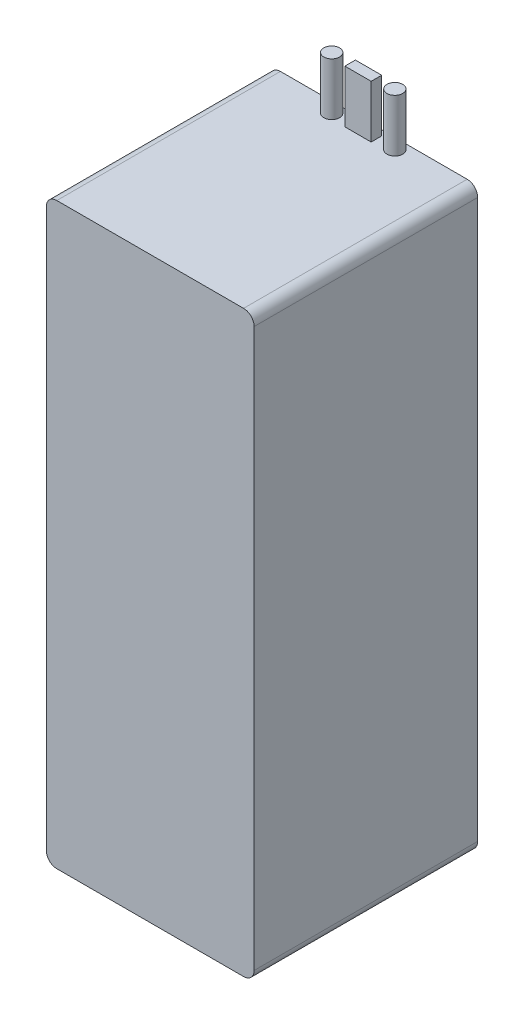
ISO-10303-21;
HEADER;
FILE_DESCRIPTION(('STEP AP214'),'2;1');
FILE_NAME('part.step','',(''),(''),'','','');
FILE_SCHEMA(('AUTOMOTIVE_DESIGN { 1 0 10303 214 1 1 1 1 }'));
ENDSEC;
DATA;
#1=APPLICATION_CONTEXT('core data for automotive mechanical design processes');
#2=APPLICATION_PROTOCOL_DEFINITION('international standard','automotive_design',2000,#1);
#3=PRODUCT_CONTEXT('',#1,'mechanical');
#4=PRODUCT('Part','Part','',(#3));
#5=PRODUCT_RELATED_PRODUCT_CATEGORY('part','',(#4));
#6=PRODUCT_DEFINITION_FORMATION('','',#4);
#7=PRODUCT_DEFINITION_CONTEXT('part definition',#1,'design');
#8=PRODUCT_DEFINITION('design','',#6,#7);
#9=PRODUCT_DEFINITION_SHAPE('','',#8);
#10=(LENGTH_UNIT() NAMED_UNIT(*) SI_UNIT(.MILLI.,.METRE.));
#11=(NAMED_UNIT(*) PLANE_ANGLE_UNIT() SI_UNIT($,.RADIAN.));
#12=(NAMED_UNIT(*) SI_UNIT($,.STERADIAN.) SOLID_ANGLE_UNIT());
#13=UNCERTAINTY_MEASURE_WITH_UNIT(LENGTH_MEASURE(1.E-05),#10,'distance_accuracy_value','');
#14=(GEOMETRIC_REPRESENTATION_CONTEXT(3) GLOBAL_UNCERTAINTY_ASSIGNED_CONTEXT((#13)) GLOBAL_UNIT_ASSIGNED_CONTEXT((#10,
#11,#12)) REPRESENTATION_CONTEXT('',''));
#15=CARTESIAN_POINT('',(0.,0.,0.));
#16=DIRECTION('',(0.,0.,1.));
#17=DIRECTION('',(1.,0.,0.));
#18=AXIS2_PLACEMENT_3D('',#15,#16,#17);
#19=CARTESIAN_POINT('',(0.,110.,0.));
#20=DIRECTION('',(0.,-1.,0.));
#21=DIRECTION('',(0.,0.,-1.));
#22=AXIS2_PLACEMENT_3D('',#19,#20,#21);
#23=PLANE('',#22);
#24=DIRECTION('',(1.,0.,0.));
#25=VECTOR('',#24,1.);
#26=CARTESIAN_POINT('',(-19.75,110.,21.25));
#27=LINE('',#26,#25);
#28=CARTESIAN_POINT('',(-17.75,110.,21.25));
#29=VERTEX_POINT('',#28);
#30=CARTESIAN_POINT('',(17.75,110.,21.25));
#31=VERTEX_POINT('',#30);
#32=EDGE_CURVE('E165',#29,#31,#27,.T.);
#33=ORIENTED_EDGE('',*,*,#32,.T.);
#34=DIRECTION('',(0.,0.,-1.));
#35=VECTOR('',#34,1.);
#36=CARTESIAN_POINT('',(17.75,110.,0.));
#37=LINE('',#36,#35);
#38=CARTESIAN_POINT('',(17.75,110.,-21.25));
#39=VERTEX_POINT('',#38);
#40=EDGE_CURVE('E193',#31,#39,#37,.T.);
#41=ORIENTED_EDGE('',*,*,#40,.T.);
#42=DIRECTION('',(-1.,0.,0.));
#43=VECTOR('',#42,1.);
#44=CARTESIAN_POINT('',(-19.75,110.,-21.25));
#45=LINE('',#44,#43);
#46=CARTESIAN_POINT('',(-17.75,110.,-21.25));
#47=VERTEX_POINT('',#46);
#48=EDGE_CURVE('E162',#39,#47,#45,.T.);
#49=ORIENTED_EDGE('',*,*,#48,.T.);
#50=DIRECTION('',(0.,0.,1.));
#51=VECTOR('',#50,1.);
#52=CARTESIAN_POINT('',(-17.75,110.,0.));
#53=LINE('',#52,#51);
#54=EDGE_CURVE('E190',#47,#29,#53,.T.);
#55=ORIENTED_EDGE('',*,*,#54,.T.);
#56=EDGE_LOOP('',(#33,#41,#49,#55));
#57=FACE_BOUND('',#56,.T.);
#58=CARTESIAN_POINT('',(-6.00000000000001,110.,-19.25));
#59=DIRECTION('',(0.,-1.,0.));
#60=DIRECTION('',(0.,0.,-1.));
#61=AXIS2_PLACEMENT_3D('',#58,#59,#60);
#62=CIRCLE('',#61,1.5);
#63=CARTESIAN_POINT('',(-6.00000000000001,110.,-20.75));
#64=VERTEX_POINT('',#63);
#65=EDGE_CURVE('E184',#64,#64,#62,.F.);
#66=ORIENTED_EDGE('',*,*,#65,.F.);
#67=EDGE_LOOP('',(#66));
#68=FACE_BOUND('',#67,.T.);
#69=CARTESIAN_POINT('',(6.,110.,-19.25));
#70=DIRECTION('',(0.,-1.,0.));
#71=DIRECTION('',(0.,0.,-1.));
#72=AXIS2_PLACEMENT_3D('',#69,#70,#71);
#73=CIRCLE('',#72,1.5);
#74=CARTESIAN_POINT('',(6.,110.,-20.75));
#75=VERTEX_POINT('',#74);
#76=EDGE_CURVE('E187',#75,#75,#73,.F.);
#77=ORIENTED_EDGE('',*,*,#76,.F.);
#78=EDGE_LOOP('',(#77));
#79=FACE_BOUND('',#78,.T.);
#80=DIRECTION('',(0.,0.,-1.));
#81=VECTOR('',#80,1.);
#82=CARTESIAN_POINT('',(2.49999999999999,110.,-20.25));
#83=LINE('',#82,#81);
#84=CARTESIAN_POINT('',(2.49999999999999,110.,-18.25));
#85=VERTEX_POINT('',#84);
#86=CARTESIAN_POINT('',(2.49999999999999,110.,-20.25));
#87=VERTEX_POINT('',#86);
#88=EDGE_CURVE('E149',#85,#87,#83,.T.);
#89=ORIENTED_EDGE('',*,*,#88,.F.);
#90=DIRECTION('',(1.,0.,0.));
#91=VECTOR('',#90,1.);
#92=CARTESIAN_POINT('',(-2.50000000000001,110.,-18.25));
#93=LINE('',#92,#91);
#94=CARTESIAN_POINT('',(-2.50000000000001,110.,-18.25));
#95=VERTEX_POINT('',#94);
#96=EDGE_CURVE('E146',#95,#85,#93,.T.);
#97=ORIENTED_EDGE('',*,*,#96,.F.);
#98=DIRECTION('',(0.,0.,1.));
#99=VECTOR('',#98,1.);
#100=CARTESIAN_POINT('',(-2.50000000000001,110.,-20.25));
#101=LINE('',#100,#99);
#102=CARTESIAN_POINT('',(-2.50000000000001,110.,-20.25));
#103=VERTEX_POINT('',#102);
#104=EDGE_CURVE('E427',#103,#95,#101,.T.);
#105=ORIENTED_EDGE('',*,*,#104,.F.);
#106=DIRECTION('',(-1.,0.,0.));
#107=VECTOR('',#106,1.);
#108=CARTESIAN_POINT('',(-2.50000000000001,110.,-20.25));
#109=LINE('',#108,#107);
#110=EDGE_CURVE('E433',#87,#103,#109,.T.);
#111=ORIENTED_EDGE('',*,*,#110,.F.);
#112=EDGE_LOOP('',(#89,#97,#105,#111));
#113=FACE_BOUND('',#112,.T.);
#114=ADVANCED_FACE('F35',(#57,#68,#79,#113),#23,.F.);
#115=CARTESIAN_POINT('',(19.75,110.,21.25));
#116=DIRECTION('',(-1.,0.,0.));
#117=DIRECTION('',(0.,0.,1.));
#118=AXIS2_PLACEMENT_3D('',#115,#116,#117);
#119=PLANE('',#118);
#120=DIRECTION('',(0.,-1.,0.));
#121=VECTOR('',#120,1.);
#122=CARTESIAN_POINT('',(19.75,110.,-21.25));
#123=LINE('',#122,#121);
#124=CARTESIAN_POINT('',(19.75,108.,-21.25));
#125=VERTEX_POINT('',#124);
#126=CARTESIAN_POINT('',(19.75,2.,-21.25));
#127=VERTEX_POINT('',#126);
#128=EDGE_CURVE('E181',#125,#127,#123,.T.);
#129=ORIENTED_EDGE('',*,*,#128,.F.);
#130=DIRECTION('',(0.,0.,-1.));
#131=VECTOR('',#130,1.);
#132=CARTESIAN_POINT('',(19.75,108.,21.25));
#133=LINE('',#132,#131);
#134=CARTESIAN_POINT('',(19.75,108.,21.25));
#135=VERTEX_POINT('',#134);
#136=EDGE_CURVE('E207',#125,#135,#133,.F.);
#137=ORIENTED_EDGE('',*,*,#136,.T.);
#138=DIRECTION('',(0.,-1.,0.));
#139=VECTOR('',#138,1.);
#140=CARTESIAN_POINT('',(19.75,110.,21.25));
#141=LINE('',#140,#139);
#142=CARTESIAN_POINT('',(19.75,2.,21.25));
#143=VERTEX_POINT('',#142);
#144=EDGE_CURVE('E169',#135,#143,#141,.T.);
#145=ORIENTED_EDGE('',*,*,#144,.T.);
#146=DIRECTION('',(0.,0.,-1.));
#147=VECTOR('',#146,1.);
#148=CARTESIAN_POINT('',(19.75,2.,-21.25));
#149=LINE('',#148,#147);
#150=EDGE_CURVE('E204',#143,#127,#149,.T.);
#151=ORIENTED_EDGE('',*,*,#150,.T.);
#152=EDGE_LOOP('',(#129,#137,#145,#151));
#153=FACE_BOUND('',#152,.T.);
#154=ADVANCED_FACE('F239',(#153),#119,.F.);
#155=CARTESIAN_POINT('',(-19.75,110.,-21.25));
#156=DIRECTION('',(0.,0.,1.));
#157=DIRECTION('',(1.,0.,0.));
#158=AXIS2_PLACEMENT_3D('',#155,#156,#157);
#159=PLANE('',#158);
#160=ORIENTED_EDGE('',*,*,#48,.F.);
#161=CARTESIAN_POINT('',(17.75,108.,-21.25));
#162=DIRECTION('',(0.,0.,1.));
#163=DIRECTION('',(1.,0.,0.));
#164=AXIS2_PLACEMENT_3D('',#161,#162,#163);
#165=CIRCLE('',#164,2.);
#166=EDGE_CURVE('E202',#39,#125,#165,.F.);
#167=ORIENTED_EDGE('',*,*,#166,.T.);
#168=ORIENTED_EDGE('',*,*,#128,.T.);
#169=CARTESIAN_POINT('',(17.75,2.,-21.25));
#170=DIRECTION('',(0.,0.,1.));
#171=DIRECTION('',(1.,0.,0.));
#172=AXIS2_PLACEMENT_3D('',#169,#170,#171);
#173=CIRCLE('',#172,2.);
#174=CARTESIAN_POINT('',(17.75,0.,-21.25));
#175=VERTEX_POINT('',#174);
#176=EDGE_CURVE('E198',#127,#175,#173,.F.);
#177=ORIENTED_EDGE('',*,*,#176,.T.);
#178=DIRECTION('',(-1.,0.,0.));
#179=VECTOR('',#178,1.);
#180=CARTESIAN_POINT('',(-19.75,0.,-21.25));
#181=LINE('',#180,#179);
#182=CARTESIAN_POINT('',(-17.75,0.,-21.25));
#183=VERTEX_POINT('',#182);
#184=EDGE_CURVE('E161',#175,#183,#181,.T.);
#185=ORIENTED_EDGE('',*,*,#184,.T.);
#186=CARTESIAN_POINT('',(-17.75,2.,-21.25));
#187=DIRECTION('',(0.,0.,1.));
#188=DIRECTION('',(1.,0.,0.));
#189=AXIS2_PLACEMENT_3D('',#186,#187,#188);
#190=CIRCLE('',#189,2.);
#191=CARTESIAN_POINT('',(-19.75,2.,-21.25));
#192=VERTEX_POINT('',#191);
#193=EDGE_CURVE('E196',#183,#192,#190,.F.);
#194=ORIENTED_EDGE('',*,*,#193,.T.);
#195=DIRECTION('',(0.,-1.,0.));
#196=VECTOR('',#195,1.);
#197=CARTESIAN_POINT('',(-19.75,110.,-21.25));
#198=LINE('',#197,#196);
#199=CARTESIAN_POINT('',(-19.75,108.,-21.25));
#200=VERTEX_POINT('',#199);
#201=EDGE_CURVE('E178',#200,#192,#198,.T.);
#202=ORIENTED_EDGE('',*,*,#201,.F.);
#203=CARTESIAN_POINT('',(-17.75,108.,-21.25));
#204=DIRECTION('',(0.,0.,1.));
#205=DIRECTION('',(1.,0.,0.));
#206=AXIS2_PLACEMENT_3D('',#203,#204,#205);
#207=CIRCLE('',#206,2.);
#208=EDGE_CURVE('E200',#200,#47,#207,.F.);
#209=ORIENTED_EDGE('',*,*,#208,.T.);
#210=EDGE_LOOP('',(#160,#167,#168,#177,#185,#194,#202,#209));
#211=FACE_BOUND('',#210,.T.);
#212=ADVANCED_FACE('F226',(#211),#159,.F.);
#213=CARTESIAN_POINT('',(-19.75,110.,21.25));
#214=DIRECTION('',(1.,0.,0.));
#215=DIRECTION('',(0.,0.,-1.));
#216=AXIS2_PLACEMENT_3D('',#213,#214,#215);
#217=PLANE('',#216);
#218=DIRECTION('',(0.,-1.,0.));
#219=VECTOR('',#218,1.);
#220=CARTESIAN_POINT('',(-19.75,110.,21.25));
#221=LINE('',#220,#219);
#222=CARTESIAN_POINT('',(-19.75,108.,21.25));
#223=VERTEX_POINT('',#222);
#224=CARTESIAN_POINT('',(-19.75,2.,21.25));
#225=VERTEX_POINT('',#224);
#226=EDGE_CURVE('E176',#223,#225,#221,.T.);
#227=ORIENTED_EDGE('',*,*,#226,.F.);
#228=DIRECTION('',(0.,0.,1.));
#229=VECTOR('',#228,1.);
#230=CARTESIAN_POINT('',(-19.75,108.,21.25));
#231=LINE('',#230,#229);
#232=EDGE_CURVE('E217',#223,#200,#231,.F.);
#233=ORIENTED_EDGE('',*,*,#232,.T.);
#234=ORIENTED_EDGE('',*,*,#201,.T.);
#235=DIRECTION('',(0.,0.,1.));
#236=VECTOR('',#235,1.);
#237=CARTESIAN_POINT('',(-19.75,2.,21.25));
#238=LINE('',#237,#236);
#239=EDGE_CURVE('E215',#192,#225,#238,.T.);
#240=ORIENTED_EDGE('',*,*,#239,.T.);
#241=EDGE_LOOP('',(#227,#233,#234,#240));
#242=FACE_BOUND('',#241,.T.);
#243=ADVANCED_FACE('F229',(#242),#217,.F.);
#244=CARTESIAN_POINT('',(-19.75,110.,21.25));
#245=DIRECTION('',(0.,0.,-1.));
#246=DIRECTION('',(-1.,0.,0.));
#247=AXIS2_PLACEMENT_3D('',#244,#245,#246);
#248=PLANE('',#247);
#249=ORIENTED_EDGE('',*,*,#144,.F.);
#250=CARTESIAN_POINT('',(17.75,108.,21.25));
#251=DIRECTION('',(0.,0.,-1.));
#252=DIRECTION('',(-1.,0.,0.));
#253=AXIS2_PLACEMENT_3D('',#250,#251,#252);
#254=CIRCLE('',#253,2.);
#255=EDGE_CURVE('E213',#135,#31,#254,.F.);
#256=ORIENTED_EDGE('',*,*,#255,.T.);
#257=ORIENTED_EDGE('',*,*,#32,.F.);
#258=CARTESIAN_POINT('',(-17.75,108.,21.25));
#259=DIRECTION('',(0.,0.,-1.));
#260=DIRECTION('',(-1.,0.,0.));
#261=AXIS2_PLACEMENT_3D('',#258,#259,#260);
#262=CIRCLE('',#261,2.);
#263=EDGE_CURVE('E58',#29,#223,#262,.F.);
#264=ORIENTED_EDGE('',*,*,#263,.T.);
#265=ORIENTED_EDGE('',*,*,#226,.T.);
#266=CARTESIAN_POINT('',(-17.75,2.,21.25));
#267=DIRECTION('',(0.,0.,-1.));
#268=DIRECTION('',(-1.,0.,0.));
#269=AXIS2_PLACEMENT_3D('',#266,#267,#268);
#270=CIRCLE('',#269,2.);
#271=CARTESIAN_POINT('',(-17.75,0.,21.25));
#272=VERTEX_POINT('',#271);
#273=EDGE_CURVE('E50',#225,#272,#270,.F.);
#274=ORIENTED_EDGE('',*,*,#273,.T.);
#275=DIRECTION('',(1.,0.,0.));
#276=VECTOR('',#275,1.);
#277=CARTESIAN_POINT('',(-19.75,0.,21.25));
#278=LINE('',#277,#276);
#279=CARTESIAN_POINT('',(17.75,0.,21.25));
#280=VERTEX_POINT('',#279);
#281=EDGE_CURVE('E166',#272,#280,#278,.T.);
#282=ORIENTED_EDGE('',*,*,#281,.T.);
#283=CARTESIAN_POINT('',(17.75,2.,21.25));
#284=DIRECTION('',(0.,0.,-1.));
#285=DIRECTION('',(-1.,0.,0.));
#286=AXIS2_PLACEMENT_3D('',#283,#284,#285);
#287=CIRCLE('',#286,2.);
#288=EDGE_CURVE('E210',#280,#143,#287,.F.);
#289=ORIENTED_EDGE('',*,*,#288,.T.);
#290=EDGE_LOOP('',(#249,#256,#257,#264,#265,#274,#282,#289));
#291=FACE_BOUND('',#290,.T.);
#292=ADVANCED_FACE('F232',(#291),#248,.F.);
#293=CARTESIAN_POINT('',(0.,0.,0.));
#294=DIRECTION('',(0.,-1.,0.));
#295=DIRECTION('',(0.,0.,-1.));
#296=AXIS2_PLACEMENT_3D('',#293,#294,#295);
#297=PLANE('',#296);
#298=ORIENTED_EDGE('',*,*,#184,.F.);
#299=DIRECTION('',(0.,0.,-1.));
#300=VECTOR('',#299,1.);
#301=CARTESIAN_POINT('',(17.75,0.,21.25));
#302=LINE('',#301,#300);
#303=EDGE_CURVE('E11',#175,#280,#302,.F.);
#304=ORIENTED_EDGE('',*,*,#303,.T.);
#305=ORIENTED_EDGE('',*,*,#281,.F.);
#306=DIRECTION('',(0.,0.,1.));
#307=VECTOR('',#306,1.);
#308=CARTESIAN_POINT('',(-17.75,0.,-21.25));
#309=LINE('',#308,#307);
#310=EDGE_CURVE('E43',#272,#183,#309,.F.);
#311=ORIENTED_EDGE('',*,*,#310,.T.);
#312=EDGE_LOOP('',(#298,#304,#305,#311));
#313=FACE_BOUND('',#312,.T.);
#314=ADVANCED_FACE('F221',(#313),#297,.T.);
#315=CARTESIAN_POINT('',(-6.00000000000001,120.,-19.25));
#316=DIRECTION('',(0.,-1.,0.));
#317=DIRECTION('',(0.,0.,-1.));
#318=AXIS2_PLACEMENT_3D('',#315,#316,#317);
#319=CYLINDRICAL_SURFACE('',#318,1.5);
#320=CARTESIAN_POINT('',(-6.00000000000001,120.,-19.25));
#321=DIRECTION('',(0.,1.,0.));
#322=DIRECTION('',(0.,0.,1.));
#323=AXIS2_PLACEMENT_3D('',#320,#321,#322);
#324=CIRCLE('',#323,1.5);
#325=CARTESIAN_POINT('',(-6.00000000000001,120.,-17.75));
#326=VERTEX_POINT('',#325);
#327=EDGE_CURVE('E153',#326,#326,#324,.T.);
#328=ORIENTED_EDGE('',*,*,#327,.F.);
#329=EDGE_LOOP('',(#328));
#330=FACE_BOUND('',#329,.T.);
#331=ORIENTED_EDGE('',*,*,#65,.T.);
#332=EDGE_LOOP('',(#331));
#333=FACE_BOUND('',#332,.T.);
#334=ADVANCED_FACE('F266',(#330,#333),#319,.T.);
#335=CARTESIAN_POINT('',(-6.00000000000001,120.,-19.25));
#336=DIRECTION('',(0.,1.,0.));
#337=DIRECTION('',(0.,0.,1.));
#338=AXIS2_PLACEMENT_3D('',#335,#336,#337);
#339=PLANE('',#338);
#340=ORIENTED_EDGE('',*,*,#327,.T.);
#341=EDGE_LOOP('',(#340));
#342=FACE_BOUND('',#341,.T.);
#343=ADVANCED_FACE('F298',(#342),#339,.T.);
#344=CARTESIAN_POINT('',(6.,120.,-19.25));
#345=DIRECTION('',(0.,-1.,0.));
#346=DIRECTION('',(0.,0.,-1.));
#347=AXIS2_PLACEMENT_3D('',#344,#345,#346);
#348=CYLINDRICAL_SURFACE('',#347,1.5);
#349=CARTESIAN_POINT('',(6.,120.,-19.25));
#350=DIRECTION('',(0.,1.,0.));
#351=DIRECTION('',(0.,0.,1.));
#352=AXIS2_PLACEMENT_3D('',#349,#350,#351);
#353=CIRCLE('',#352,1.5);
#354=CARTESIAN_POINT('',(6.,120.,-17.75));
#355=VERTEX_POINT('',#354);
#356=EDGE_CURVE('E150',#355,#355,#353,.T.);
#357=ORIENTED_EDGE('',*,*,#356,.F.);
#358=EDGE_LOOP('',(#357));
#359=FACE_BOUND('',#358,.T.);
#360=ORIENTED_EDGE('',*,*,#76,.T.);
#361=EDGE_LOOP('',(#360));
#362=FACE_BOUND('',#361,.T.);
#363=ADVANCED_FACE('F306',(#359,#362),#348,.T.);
#364=CARTESIAN_POINT('',(6.,120.,-19.25));
#365=DIRECTION('',(0.,1.,0.));
#366=DIRECTION('',(0.,0.,1.));
#367=AXIS2_PLACEMENT_3D('',#364,#365,#366);
#368=PLANE('',#367);
#369=ORIENTED_EDGE('',*,*,#356,.T.);
#370=EDGE_LOOP('',(#369));
#371=FACE_BOUND('',#370,.T.);
#372=ADVANCED_FACE('F312',(#371),#368,.T.);
#373=CARTESIAN_POINT('',(2.49999999999999,120.,-20.25));
#374=DIRECTION('',(-1.,0.,0.));
#375=DIRECTION('',(0.,0.,1.));
#376=AXIS2_PLACEMENT_3D('',#373,#374,#375);
#377=PLANE('',#376);
#378=ORIENTED_EDGE('',*,*,#88,.T.);
#379=DIRECTION('',(0.,-1.,0.));
#380=VECTOR('',#379,1.);
#381=CARTESIAN_POINT('',(2.49999999999999,120.,-20.25));
#382=LINE('',#381,#380);
#383=CARTESIAN_POINT('',(2.49999999999999,120.,-20.25));
#384=VERTEX_POINT('',#383);
#385=EDGE_CURVE('E130',#384,#87,#382,.T.);
#386=ORIENTED_EDGE('',*,*,#385,.F.);
#387=DIRECTION('',(0.,0.,-1.));
#388=VECTOR('',#387,1.);
#389=CARTESIAN_POINT('',(2.49999999999999,120.,-20.25));
#390=LINE('',#389,#388);
#391=CARTESIAN_POINT('',(2.49999999999999,120.,-18.25));
#392=VERTEX_POINT('',#391);
#393=EDGE_CURVE('E137',#392,#384,#390,.T.);
#394=ORIENTED_EDGE('',*,*,#393,.F.);
#395=DIRECTION('',(0.,-1.,0.));
#396=VECTOR('',#395,1.);
#397=CARTESIAN_POINT('',(2.49999999999999,120.,-18.25));
#398=LINE('',#397,#396);
#399=EDGE_CURVE('E423',#392,#85,#398,.T.);
#400=ORIENTED_EDGE('',*,*,#399,.T.);
#401=EDGE_LOOP('',(#378,#386,#394,#400));
#402=FACE_BOUND('',#401,.T.);
#403=ADVANCED_FACE('F148',(#402),#377,.F.);
#404=CARTESIAN_POINT('',(-2.50000000000001,120.,-20.25));
#405=DIRECTION('',(0.,0.,1.));
#406=DIRECTION('',(1.,0.,0.));
#407=AXIS2_PLACEMENT_3D('',#404,#405,#406);
#408=PLANE('',#407);
#409=ORIENTED_EDGE('',*,*,#110,.T.);
#410=DIRECTION('',(0.,-1.,0.));
#411=VECTOR('',#410,1.);
#412=CARTESIAN_POINT('',(-2.50000000000001,120.,-20.25));
#413=LINE('',#412,#411);
#414=CARTESIAN_POINT('',(-2.50000000000001,120.,-20.25));
#415=VERTEX_POINT('',#414);
#416=EDGE_CURVE('E133',#415,#103,#413,.T.);
#417=ORIENTED_EDGE('',*,*,#416,.F.);
#418=DIRECTION('',(-1.,0.,0.));
#419=VECTOR('',#418,1.);
#420=CARTESIAN_POINT('',(-2.50000000000001,120.,-20.25));
#421=LINE('',#420,#419);
#422=EDGE_CURVE('E125',#384,#415,#421,.T.);
#423=ORIENTED_EDGE('',*,*,#422,.F.);
#424=ORIENTED_EDGE('',*,*,#385,.T.);
#425=EDGE_LOOP('',(#409,#417,#423,#424));
#426=FACE_BOUND('',#425,.T.);
#427=ADVANCED_FACE('F128',(#426),#408,.F.);
#428=CARTESIAN_POINT('',(-2.50000000000001,120.,-20.25));
#429=DIRECTION('',(1.,0.,0.));
#430=DIRECTION('',(0.,0.,-1.));
#431=AXIS2_PLACEMENT_3D('',#428,#429,#430);
#432=PLANE('',#431);
#433=ORIENTED_EDGE('',*,*,#104,.T.);
#434=DIRECTION('',(0.,-1.,0.));
#435=VECTOR('',#434,1.);
#436=CARTESIAN_POINT('',(-2.50000000000001,120.,-18.25));
#437=LINE('',#436,#435);
#438=CARTESIAN_POINT('',(-2.50000000000001,120.,-18.25));
#439=VERTEX_POINT('',#438);
#440=EDGE_CURVE('E155',#439,#95,#437,.T.);
#441=ORIENTED_EDGE('',*,*,#440,.F.);
#442=DIRECTION('',(0.,0.,1.));
#443=VECTOR('',#442,1.);
#444=CARTESIAN_POINT('',(-2.50000000000001,120.,-20.25));
#445=LINE('',#444,#443);
#446=EDGE_CURVE('E136',#415,#439,#445,.T.);
#447=ORIENTED_EDGE('',*,*,#446,.F.);
#448=ORIENTED_EDGE('',*,*,#416,.T.);
#449=EDGE_LOOP('',(#433,#441,#447,#448));
#450=FACE_BOUND('',#449,.T.);
#451=ADVANCED_FACE('F333',(#450),#432,.F.);
#452=CARTESIAN_POINT('',(-2.50000000000001,120.,-18.25));
#453=DIRECTION('',(0.,0.,-1.));
#454=DIRECTION('',(-1.,0.,0.));
#455=AXIS2_PLACEMENT_3D('',#452,#453,#454);
#456=PLANE('',#455);
#457=ORIENTED_EDGE('',*,*,#96,.T.);
#458=ORIENTED_EDGE('',*,*,#399,.F.);
#459=DIRECTION('',(1.,0.,0.));
#460=VECTOR('',#459,1.);
#461=CARTESIAN_POINT('',(-2.50000000000001,120.,-18.25));
#462=LINE('',#461,#460);
#463=EDGE_CURVE('E142',#439,#392,#462,.T.);
#464=ORIENTED_EDGE('',*,*,#463,.F.);
#465=ORIENTED_EDGE('',*,*,#440,.T.);
#466=EDGE_LOOP('',(#457,#458,#464,#465));
#467=FACE_BOUND('',#466,.T.);
#468=ADVANCED_FACE('F340',(#467),#456,.F.);
#469=CARTESIAN_POINT('',(0.,120.,0.));
#470=DIRECTION('',(0.,1.,0.));
#471=DIRECTION('',(0.,0.,1.));
#472=AXIS2_PLACEMENT_3D('',#469,#470,#471);
#473=PLANE('',#472);
#474=ORIENTED_EDGE('',*,*,#393,.T.);
#475=ORIENTED_EDGE('',*,*,#422,.T.);
#476=ORIENTED_EDGE('',*,*,#446,.T.);
#477=ORIENTED_EDGE('',*,*,#463,.T.);
#478=EDGE_LOOP('',(#474,#475,#476,#477));
#479=FACE_BOUND('',#478,.T.);
#480=ADVANCED_FACE('F140',(#479),#473,.T.);
#481=CARTESIAN_POINT('',(17.75,108.,0.));
#482=DIRECTION('',(0.,0.,-1.));
#483=DIRECTION('',(-1.,0.,0.));
#484=AXIS2_PLACEMENT_3D('',#481,#482,#483);
#485=CYLINDRICAL_SURFACE('',#484,2.);
#486=ORIENTED_EDGE('',*,*,#255,.F.);
#487=ORIENTED_EDGE('',*,*,#136,.F.);
#488=ORIENTED_EDGE('',*,*,#166,.F.);
#489=ORIENTED_EDGE('',*,*,#40,.F.);
#490=EDGE_LOOP('',(#486,#487,#488,#489));
#491=FACE_BOUND('',#490,.T.);
#492=ADVANCED_FACE('F244',(#491),#485,.T.);
#493=CARTESIAN_POINT('',(-17.75,108.,0.));
#494=DIRECTION('',(0.,0.,1.));
#495=DIRECTION('',(1.,0.,0.));
#496=AXIS2_PLACEMENT_3D('',#493,#494,#495);
#497=CYLINDRICAL_SURFACE('',#496,2.);
#498=ORIENTED_EDGE('',*,*,#208,.F.);
#499=ORIENTED_EDGE('',*,*,#232,.F.);
#500=ORIENTED_EDGE('',*,*,#263,.F.);
#501=ORIENTED_EDGE('',*,*,#54,.F.);
#502=EDGE_LOOP('',(#498,#499,#500,#501));
#503=FACE_BOUND('',#502,.T.);
#504=ADVANCED_FACE('F250',(#503),#497,.T.);
#505=CARTESIAN_POINT('',(17.75,2.,21.25));
#506=DIRECTION('',(0.,0.,1.));
#507=DIRECTION('',(1.,0.,0.));
#508=AXIS2_PLACEMENT_3D('',#505,#506,#507);
#509=CYLINDRICAL_SURFACE('',#508,2.);
#510=ORIENTED_EDGE('',*,*,#288,.F.);
#511=ORIENTED_EDGE('',*,*,#303,.F.);
#512=ORIENTED_EDGE('',*,*,#176,.F.);
#513=ORIENTED_EDGE('',*,*,#150,.F.);
#514=EDGE_LOOP('',(#510,#511,#512,#513));
#515=FACE_BOUND('',#514,.T.);
#516=ADVANCED_FACE('F236',(#515),#509,.T.);
#517=CARTESIAN_POINT('',(-17.75,2.,21.25));
#518=DIRECTION('',(0.,0.,-1.));
#519=DIRECTION('',(-1.,0.,0.));
#520=AXIS2_PLACEMENT_3D('',#517,#518,#519);
#521=CYLINDRICAL_SURFACE('',#520,2.);
#522=ORIENTED_EDGE('',*,*,#193,.F.);
#523=ORIENTED_EDGE('',*,*,#310,.F.);
#524=ORIENTED_EDGE('',*,*,#273,.F.);
#525=ORIENTED_EDGE('',*,*,#239,.F.);
#526=EDGE_LOOP('',(#522,#523,#524,#525));
#527=FACE_BOUND('',#526,.T.);
#528=ADVANCED_FACE('F37',(#527),#521,.T.);
#529=CLOSED_SHELL('',(#114,#154,#212,#243,#292,#314,#334,#343,#363,#372,#403,#427,#451,#468,
#480,#492,#504,#516,#528));
#530=MANIFOLD_SOLID_BREP('B2',#529);
#531=ADVANCED_BREP_SHAPE_REPRESENTATION('',(#18,#530),#14);
#532=SHAPE_DEFINITION_REPRESENTATION(#9,#531);
ENDSEC;
END-ISO-10303-21;
